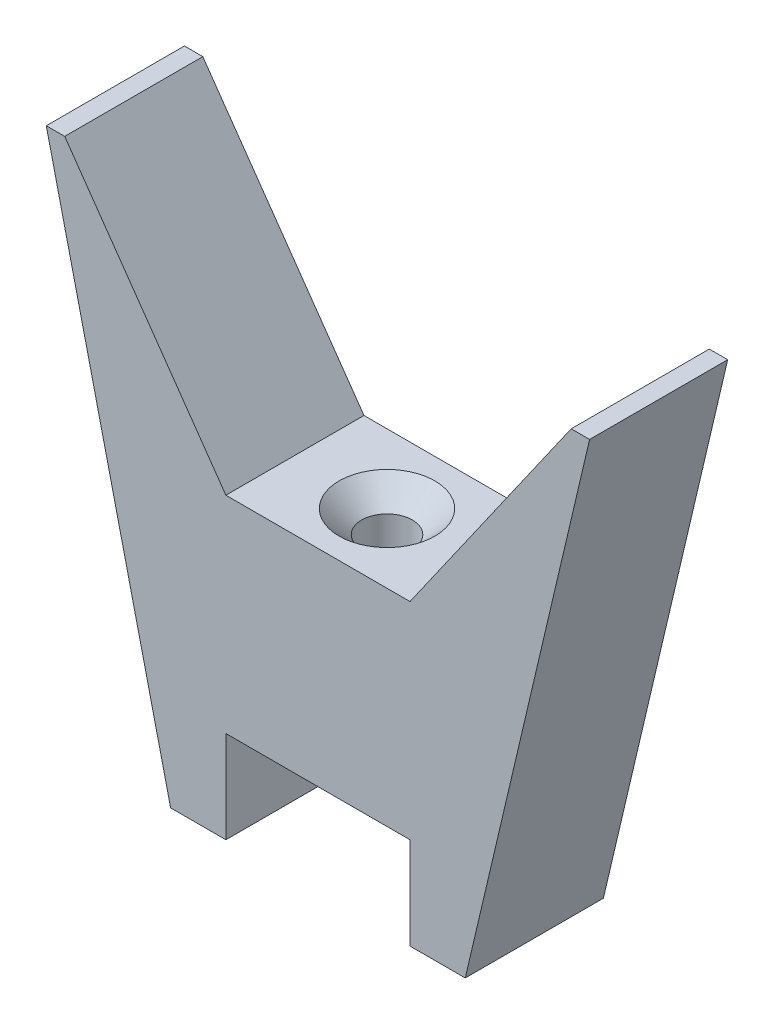
ISO-10303-21;
HEADER;
FILE_DESCRIPTION(('STEP AP214'),'2;1');
FILE_NAME('part.step','',(''),(''),'','','');
FILE_SCHEMA(('AUTOMOTIVE_DESIGN { 1 0 10303 214 1 1 1 1 }'));
ENDSEC;
DATA;
#1=APPLICATION_CONTEXT('core data for automotive mechanical design processes');
#2=APPLICATION_PROTOCOL_DEFINITION('international standard','automotive_design',2000,#1);
#3=PRODUCT_CONTEXT('',#1,'mechanical');
#4=PRODUCT('Part','Part','',(#3));
#5=PRODUCT_RELATED_PRODUCT_CATEGORY('part','',(#4));
#6=PRODUCT_DEFINITION_FORMATION('','',#4);
#7=PRODUCT_DEFINITION_CONTEXT('part definition',#1,'design');
#8=PRODUCT_DEFINITION('design','',#6,#7);
#9=PRODUCT_DEFINITION_SHAPE('','',#8);
#10=(LENGTH_UNIT() NAMED_UNIT(*) SI_UNIT(.MILLI.,.METRE.));
#11=(NAMED_UNIT(*) PLANE_ANGLE_UNIT() SI_UNIT($,.RADIAN.));
#12=(NAMED_UNIT(*) SI_UNIT($,.STERADIAN.) SOLID_ANGLE_UNIT());
#13=UNCERTAINTY_MEASURE_WITH_UNIT(LENGTH_MEASURE(1.E-05),#10,'distance_accuracy_value','');
#14=(GEOMETRIC_REPRESENTATION_CONTEXT(3) GLOBAL_UNCERTAINTY_ASSIGNED_CONTEXT((#13)) GLOBAL_UNIT_ASSIGNED_CONTEXT((#10,
#11,#12)) REPRESENTATION_CONTEXT('',''));
#15=CARTESIAN_POINT('',(0.,0.,0.));
#16=DIRECTION('',(0.,0.,1.));
#17=DIRECTION('',(1.,0.,0.));
#18=AXIS2_PLACEMENT_3D('',#15,#16,#17);
#19=CARTESIAN_POINT('',(-10.,0.,7.5));
#20=DIRECTION('',(0.,1.,0.));
#21=DIRECTION('',(-1.,0.,0.));
#22=AXIS2_PLACEMENT_3D('',#19,#20,#21);
#23=PLANE('',#22);
#24=DIRECTION('',(1.,0.,0.));
#25=VECTOR('',#24,1.);
#26=CARTESIAN_POINT('',(-10.,0.,-7.5));
#27=LINE('',#26,#25);
#28=CARTESIAN_POINT('',(-16.,0.,-7.5));
#29=VERTEX_POINT('',#28);
#30=CARTESIAN_POINT('',(-10.,0.,-7.5));
#31=VERTEX_POINT('',#30);
#32=EDGE_CURVE('E157',#29,#31,#27,.T.);
#33=ORIENTED_EDGE('',*,*,#32,.T.);
#34=DIRECTION('',(0.,0.,-1.));
#35=VECTOR('',#34,1.);
#36=CARTESIAN_POINT('',(-10.,0.,7.5));
#37=LINE('',#36,#35);
#38=CARTESIAN_POINT('',(-10.,0.,7.5));
#39=VERTEX_POINT('',#38);
#40=EDGE_CURVE('E11',#39,#31,#37,.T.);
#41=ORIENTED_EDGE('',*,*,#40,.F.);
#42=DIRECTION('',(1.,0.,0.));
#43=VECTOR('',#42,1.);
#44=CARTESIAN_POINT('',(-10.,0.,7.5));
#45=LINE('',#44,#43);
#46=CARTESIAN_POINT('',(-16.,0.,7.5));
#47=VERTEX_POINT('',#46);
#48=EDGE_CURVE('E179',#47,#39,#45,.T.);
#49=ORIENTED_EDGE('',*,*,#48,.F.);
#50=DIRECTION('',(0.,0.,-1.));
#51=VECTOR('',#50,1.);
#52=CARTESIAN_POINT('',(-16.,0.,7.5));
#53=LINE('',#52,#51);
#54=EDGE_CURVE('E153',#47,#29,#53,.T.);
#55=ORIENTED_EDGE('',*,*,#54,.T.);
#56=EDGE_LOOP('',(#33,#41,#49,#55));
#57=FACE_BOUND('',#56,.T.);
#58=ADVANCED_FACE('F36',(#57),#23,.F.);
#59=CARTESIAN_POINT('',(-10.,0.,7.5));
#60=DIRECTION('',(-1.,0.,0.));
#61=DIRECTION('',(0.,0.,1.));
#62=AXIS2_PLACEMENT_3D('',#59,#60,#61);
#63=PLANE('',#62);
#64=DIRECTION('',(0.,1.,0.));
#65=VECTOR('',#64,1.);
#66=CARTESIAN_POINT('',(-10.,0.,-7.5));
#67=LINE('',#66,#65);
#68=CARTESIAN_POINT('',(-10.,10.,-7.5));
#69=VERTEX_POINT('',#68);
#70=EDGE_CURVE('E160',#31,#69,#67,.T.);
#71=ORIENTED_EDGE('',*,*,#70,.T.);
#72=DIRECTION('',(0.,0.,-1.));
#73=VECTOR('',#72,1.);
#74=CARTESIAN_POINT('',(-10.,10.,7.5));
#75=LINE('',#74,#73);
#76=CARTESIAN_POINT('',(-10.,10.,7.5));
#77=VERTEX_POINT('',#76);
#78=EDGE_CURVE('E45',#77,#69,#75,.T.);
#79=ORIENTED_EDGE('',*,*,#78,.F.);
#80=DIRECTION('',(0.,1.,0.));
#81=VECTOR('',#80,1.);
#82=CARTESIAN_POINT('',(-10.,0.,7.5));
#83=LINE('',#82,#81);
#84=EDGE_CURVE('E108',#39,#77,#83,.T.);
#85=ORIENTED_EDGE('',*,*,#84,.F.);
#86=ORIENTED_EDGE('',*,*,#40,.T.);
#87=EDGE_LOOP('',(#71,#79,#85,#86));
#88=FACE_BOUND('',#87,.T.);
#89=ADVANCED_FACE('F258',(#88),#63,.F.);
#90=CARTESIAN_POINT('',(-10.,10.,7.5));
#91=DIRECTION('',(0.,1.,0.));
#92=DIRECTION('',(0.,0.,1.));
#93=AXIS2_PLACEMENT_3D('',#90,#91,#92);
#94=PLANE('',#93);
#95=CARTESIAN_POINT('',(0.,10.,0.));
#96=DIRECTION('',(0.,1.,0.));
#97=DIRECTION('',(0.,0.,1.));
#98=AXIS2_PLACEMENT_3D('',#95,#96,#97);
#99=CIRCLE('',#98,2.74999999999999);
#100=CARTESIAN_POINT('',(0.,10.,2.74999999999999));
#101=VERTEX_POINT('',#100);
#102=EDGE_CURVE('E39',#101,#101,#99,.T.);
#103=ORIENTED_EDGE('',*,*,#102,.T.);
#104=EDGE_LOOP('',(#103));
#105=FACE_BOUND('',#104,.T.);
#106=DIRECTION('',(1.,0.,0.));
#107=VECTOR('',#106,1.);
#108=CARTESIAN_POINT('',(-10.,10.,-7.5));
#109=LINE('',#108,#107);
#110=CARTESIAN_POINT('',(10.,10.,-7.5));
#111=VERTEX_POINT('',#110);
#112=EDGE_CURVE('E162',#69,#111,#109,.T.);
#113=ORIENTED_EDGE('',*,*,#112,.T.);
#114=DIRECTION('',(0.,0.,-1.));
#115=VECTOR('',#114,1.);
#116=CARTESIAN_POINT('',(10.,10.,7.5));
#117=LINE('',#116,#115);
#118=CARTESIAN_POINT('',(10.,10.,7.5));
#119=VERTEX_POINT('',#118);
#120=EDGE_CURVE('E198',#119,#111,#117,.T.);
#121=ORIENTED_EDGE('',*,*,#120,.F.);
#122=DIRECTION('',(1.,0.,0.));
#123=VECTOR('',#122,1.);
#124=CARTESIAN_POINT('',(-10.,10.,7.5));
#125=LINE('',#124,#123);
#126=EDGE_CURVE('E207',#77,#119,#125,.T.);
#127=ORIENTED_EDGE('',*,*,#126,.F.);
#128=ORIENTED_EDGE('',*,*,#78,.T.);
#129=EDGE_LOOP('',(#113,#121,#127,#128));
#130=FACE_BOUND('',#129,.T.);
#131=ADVANCED_FACE('F205',(#105,#130),#94,.F.);
#132=CARTESIAN_POINT('',(10.,0.,7.5));
#133=DIRECTION('',(1.,0.,0.));
#134=DIRECTION('',(0.,0.,-1.));
#135=AXIS2_PLACEMENT_3D('',#132,#133,#134);
#136=PLANE('',#135);
#137=DIRECTION('',(0.,-1.,0.));
#138=VECTOR('',#137,1.);
#139=CARTESIAN_POINT('',(10.,0.,-7.5));
#140=LINE('',#139,#138);
#141=CARTESIAN_POINT('',(10.,0.,-7.5));
#142=VERTEX_POINT('',#141);
#143=EDGE_CURVE('E164',#111,#142,#140,.T.);
#144=ORIENTED_EDGE('',*,*,#143,.T.);
#145=DIRECTION('',(0.,0.,-1.));
#146=VECTOR('',#145,1.);
#147=CARTESIAN_POINT('',(10.,0.,7.5));
#148=LINE('',#147,#146);
#149=CARTESIAN_POINT('',(10.,0.,7.5));
#150=VERTEX_POINT('',#149);
#151=EDGE_CURVE('E195',#150,#142,#148,.T.);
#152=ORIENTED_EDGE('',*,*,#151,.F.);
#153=DIRECTION('',(0.,-1.,0.));
#154=VECTOR('',#153,1.);
#155=CARTESIAN_POINT('',(10.,0.,7.5));
#156=LINE('',#155,#154);
#157=EDGE_CURVE('E225',#119,#150,#156,.T.);
#158=ORIENTED_EDGE('',*,*,#157,.F.);
#159=ORIENTED_EDGE('',*,*,#120,.T.);
#160=EDGE_LOOP('',(#144,#152,#158,#159));
#161=FACE_BOUND('',#160,.T.);
#162=ADVANCED_FACE('F216',(#161),#136,.F.);
#163=CARTESIAN_POINT('',(10.,0.,7.5));
#164=DIRECTION('',(0.,1.,0.));
#165=DIRECTION('',(-1.,0.,0.));
#166=AXIS2_PLACEMENT_3D('',#163,#164,#165);
#167=PLANE('',#166);
#168=DIRECTION('',(1.,0.,0.));
#169=VECTOR('',#168,1.);
#170=CARTESIAN_POINT('',(10.,0.,-7.5));
#171=LINE('',#170,#169);
#172=CARTESIAN_POINT('',(16.,0.,-7.5));
#173=VERTEX_POINT('',#172);
#174=EDGE_CURVE('E166',#142,#173,#171,.T.);
#175=ORIENTED_EDGE('',*,*,#174,.T.);
#176=DIRECTION('',(0.,0.,-1.));
#177=VECTOR('',#176,1.);
#178=CARTESIAN_POINT('',(16.,0.,7.5));
#179=LINE('',#178,#177);
#180=CARTESIAN_POINT('',(16.,0.,7.5));
#181=VERTEX_POINT('',#180);
#182=EDGE_CURVE('E192',#181,#173,#179,.T.);
#183=ORIENTED_EDGE('',*,*,#182,.F.);
#184=DIRECTION('',(1.,0.,0.));
#185=VECTOR('',#184,1.);
#186=CARTESIAN_POINT('',(10.,0.,7.5));
#187=LINE('',#186,#185);
#188=EDGE_CURVE('E222',#150,#181,#187,.T.);
#189=ORIENTED_EDGE('',*,*,#188,.F.);
#190=ORIENTED_EDGE('',*,*,#151,.T.);
#191=EDGE_LOOP('',(#175,#183,#189,#190));
#192=FACE_BOUND('',#191,.T.);
#193=ADVANCED_FACE('F220',(#192),#167,.F.);
#194=CARTESIAN_POINT('',(16.,0.,7.5));
#195=DIRECTION('',(-0.973429070908722,0.22898874188436,0.));
#196=DIRECTION('',(-0.22898874188436,-0.973429070908722,0.));
#197=AXIS2_PLACEMENT_3D('',#194,#195,#196);
#198=PLANE('',#197);
#199=DIRECTION('',(0.22898874188436,0.973429070908722,0.));
#200=VECTOR('',#199,1.);
#201=CARTESIAN_POINT('',(16.,0.,-7.5));
#202=LINE('',#201,#200);
#203=CARTESIAN_POINT('',(29.5051884552424,57.4104339901248,-7.5));
#204=VERTEX_POINT('',#203);
#205=EDGE_CURVE('E168',#173,#204,#202,.T.);
#206=ORIENTED_EDGE('',*,*,#205,.T.);
#207=DIRECTION('',(0.,0.,-1.));
#208=VECTOR('',#207,1.);
#209=CARTESIAN_POINT('',(29.5051884552424,57.4104339901248,7.5));
#210=LINE('',#209,#208);
#211=CARTESIAN_POINT('',(29.5051884552424,57.4104339901248,7.5));
#212=VERTEX_POINT('',#211);
#213=EDGE_CURVE('E189',#212,#204,#210,.T.);
#214=ORIENTED_EDGE('',*,*,#213,.F.);
#215=DIRECTION('',(0.22898874188436,0.973429070908722,0.));
#216=VECTOR('',#215,1.);
#217=CARTESIAN_POINT('',(16.,0.,7.5));
#218=LINE('',#217,#216);
#219=EDGE_CURVE('E224',#181,#212,#218,.T.);
#220=ORIENTED_EDGE('',*,*,#219,.F.);
#221=ORIENTED_EDGE('',*,*,#182,.T.);
#222=EDGE_LOOP('',(#206,#214,#220,#221));
#223=FACE_BOUND('',#222,.T.);
#224=ADVANCED_FACE('F272',(#223),#198,.F.);
#225=CARTESIAN_POINT('',(29.5051884552424,57.4104339901248,7.5));
#226=DIRECTION('',(0.,-1.,0.));
#227=DIRECTION('',(0.,0.,-1.));
#228=AXIS2_PLACEMENT_3D('',#225,#226,#227);
#229=PLANE('',#228);
#230=DIRECTION('',(-1.,0.,0.));
#231=VECTOR('',#230,1.);
#232=CARTESIAN_POINT('',(29.5051884552424,57.4104339901248,-7.5));
#233=LINE('',#232,#231);
#234=CARTESIAN_POINT('',(27.5051884552424,57.4104339901248,-7.5));
#235=VERTEX_POINT('',#234);
#236=EDGE_CURVE('E170',#204,#235,#233,.T.);
#237=ORIENTED_EDGE('',*,*,#236,.T.);
#238=DIRECTION('',(0.,0.,-1.));
#239=VECTOR('',#238,1.);
#240=CARTESIAN_POINT('',(27.5051884552424,57.4104339901248,7.5));
#241=LINE('',#240,#239);
#242=CARTESIAN_POINT('',(27.5051884552424,57.4104339901248,7.5));
#243=VERTEX_POINT('',#242);
#244=EDGE_CURVE('E186',#243,#235,#241,.T.);
#245=ORIENTED_EDGE('',*,*,#244,.F.);
#246=DIRECTION('',(-1.,0.,0.));
#247=VECTOR('',#246,1.);
#248=CARTESIAN_POINT('',(29.5051884552424,57.4104339901248,7.5));
#249=LINE('',#248,#247);
#250=EDGE_CURVE('E227',#212,#243,#249,.T.);
#251=ORIENTED_EDGE('',*,*,#250,.F.);
#252=ORIENTED_EDGE('',*,*,#213,.T.);
#253=EDGE_LOOP('',(#237,#245,#251,#252));
#254=FACE_BOUND('',#253,.T.);
#255=ADVANCED_FACE('F275',(#254),#229,.F.);
#256=CARTESIAN_POINT('',(27.5051884552424,57.4104339901248,7.5));
#257=DIRECTION('',(0.819152044288998,-0.573576436351037,0.));
#258=DIRECTION('',(0.573576436351037,0.819152044288998,0.));
#259=AXIS2_PLACEMENT_3D('',#256,#257,#258);
#260=PLANE('',#259);
#261=DIRECTION('',(-0.573576436351037,-0.819152044288998,0.));
#262=VECTOR('',#261,1.);
#263=CARTESIAN_POINT('',(27.5051884552424,57.4104339901248,-7.5));
#264=LINE('',#263,#262);
#265=CARTESIAN_POINT('',(10.,32.4104339901248,-7.5));
#266=VERTEX_POINT('',#265);
#267=EDGE_CURVE('E172',#235,#266,#264,.T.);
#268=ORIENTED_EDGE('',*,*,#267,.T.);
#269=DIRECTION('',(0.,0.,-1.));
#270=VECTOR('',#269,1.);
#271=CARTESIAN_POINT('',(10.,32.4104339901248,7.5));
#272=LINE('',#271,#270);
#273=CARTESIAN_POINT('',(10.,32.4104339901248,7.5));
#274=VERTEX_POINT('',#273);
#275=EDGE_CURVE('E183',#274,#266,#272,.T.);
#276=ORIENTED_EDGE('',*,*,#275,.F.);
#277=DIRECTION('',(-0.573576436351037,-0.819152044288998,0.));
#278=VECTOR('',#277,1.);
#279=CARTESIAN_POINT('',(27.5051884552424,57.4104339901248,7.5));
#280=LINE('',#279,#278);
#281=EDGE_CURVE('E233',#243,#274,#280,.T.);
#282=ORIENTED_EDGE('',*,*,#281,.F.);
#283=ORIENTED_EDGE('',*,*,#244,.T.);
#284=EDGE_LOOP('',(#268,#276,#282,#283));
#285=FACE_BOUND('',#284,.T.);
#286=ADVANCED_FACE('F239',(#285),#260,.F.);
#287=CARTESIAN_POINT('',(-10.,32.4104339901248,7.5));
#288=DIRECTION('',(0.,-1.,0.));
#289=DIRECTION('',(0.,0.,-1.));
#290=AXIS2_PLACEMENT_3D('',#287,#288,#289);
#291=PLANE('',#290);
#292=CARTESIAN_POINT('',(0.,32.4104339901248,0.));
#293=DIRECTION('',(0.,1.,0.));
#294=DIRECTION('',(0.,0.,1.));
#295=AXIS2_PLACEMENT_3D('',#292,#293,#294);
#296=CIRCLE('',#295,5.2);
#297=CARTESIAN_POINT('',(0.,32.4104339901248,5.2));
#298=VERTEX_POINT('',#297);
#299=EDGE_CURVE('E423',#298,#298,#296,.T.);
#300=ORIENTED_EDGE('',*,*,#299,.F.);
#301=EDGE_LOOP('',(#300));
#302=FACE_BOUND('',#301,.T.);
#303=DIRECTION('',(-1.,0.,0.));
#304=VECTOR('',#303,1.);
#305=CARTESIAN_POINT('',(-10.,32.4104339901248,-7.5));
#306=LINE('',#305,#304);
#307=CARTESIAN_POINT('',(-10.,32.4104339901248,-7.5));
#308=VERTEX_POINT('',#307);
#309=EDGE_CURVE('E174',#266,#308,#306,.T.);
#310=ORIENTED_EDGE('',*,*,#309,.T.);
#311=DIRECTION('',(0.,0.,-1.));
#312=VECTOR('',#311,1.);
#313=CARTESIAN_POINT('',(-10.,32.4104339901248,7.5));
#314=LINE('',#313,#312);
#315=CARTESIAN_POINT('',(-10.,32.4104339901248,7.5));
#316=VERTEX_POINT('',#315);
#317=EDGE_CURVE('E148',#316,#308,#314,.T.);
#318=ORIENTED_EDGE('',*,*,#317,.F.);
#319=DIRECTION('',(-1.,0.,0.));
#320=VECTOR('',#319,1.);
#321=CARTESIAN_POINT('',(-10.,32.4104339901248,7.5));
#322=LINE('',#321,#320);
#323=EDGE_CURVE('E139',#274,#316,#322,.T.);
#324=ORIENTED_EDGE('',*,*,#323,.F.);
#325=ORIENTED_EDGE('',*,*,#275,.T.);
#326=EDGE_LOOP('',(#310,#318,#324,#325));
#327=FACE_BOUND('',#326,.T.);
#328=ADVANCED_FACE('F243',(#302,#327),#291,.F.);
#329=CARTESIAN_POINT('',(-27.5051884552433,57.4104339901266,7.5));
#330=DIRECTION('',(-0.819152044289002,-0.573576436351031,0.));
#331=DIRECTION('',(0.573576436351031,-0.819152044289003,0.));
#332=AXIS2_PLACEMENT_3D('',#329,#330,#331);
#333=PLANE('',#332);
#334=DIRECTION('',(-0.573576436351031,0.819152044289003,0.));
#335=VECTOR('',#334,1.);
#336=CARTESIAN_POINT('',(-27.5051884552433,57.4104339901266,-7.5));
#337=LINE('',#336,#335);
#338=CARTESIAN_POINT('',(-27.5051884552433,57.4104339901266,-7.5));
#339=VERTEX_POINT('',#338);
#340=EDGE_CURVE('E147',#308,#339,#337,.T.);
#341=ORIENTED_EDGE('',*,*,#340,.T.);
#342=DIRECTION('',(0.,0.,-1.));
#343=VECTOR('',#342,1.);
#344=CARTESIAN_POINT('',(-27.5051884552433,57.4104339901266,7.5));
#345=LINE('',#344,#343);
#346=CARTESIAN_POINT('',(-27.5051884552433,57.4104339901266,7.5));
#347=VERTEX_POINT('',#346);
#348=EDGE_CURVE('E144',#347,#339,#345,.T.);
#349=ORIENTED_EDGE('',*,*,#348,.F.);
#350=DIRECTION('',(-0.573576436351031,0.819152044289003,0.));
#351=VECTOR('',#350,1.);
#352=CARTESIAN_POINT('',(-27.5051884552433,57.4104339901266,7.5));
#353=LINE('',#352,#351);
#354=EDGE_CURVE('E133',#316,#347,#353,.T.);
#355=ORIENTED_EDGE('',*,*,#354,.F.);
#356=ORIENTED_EDGE('',*,*,#317,.T.);
#357=EDGE_LOOP('',(#341,#349,#355,#356));
#358=FACE_BOUND('',#357,.T.);
#359=ADVANCED_FACE('F145',(#358),#333,.F.);
#360=CARTESIAN_POINT('',(-29.5051884552433,57.4104339901266,7.5));
#361=DIRECTION('',(0.,-1.,0.));
#362=DIRECTION('',(0.,0.,-1.));
#363=AXIS2_PLACEMENT_3D('',#360,#361,#362);
#364=PLANE('',#363);
#365=DIRECTION('',(-1.,0.,0.));
#366=VECTOR('',#365,1.);
#367=CARTESIAN_POINT('',(-29.5051884552433,57.4104339901266,-7.5));
#368=LINE('',#367,#366);
#369=CARTESIAN_POINT('',(-29.5051884552433,57.4104339901266,-7.5));
#370=VERTEX_POINT('',#369);
#371=EDGE_CURVE('E94',#339,#370,#368,.T.);
#372=ORIENTED_EDGE('',*,*,#371,.T.);
#373=DIRECTION('',(0.,0.,-1.));
#374=VECTOR('',#373,1.);
#375=CARTESIAN_POINT('',(-29.5051884552433,57.4104339901266,7.5));
#376=LINE('',#375,#374);
#377=CARTESIAN_POINT('',(-29.5051884552433,57.4104339901266,7.5));
#378=VERTEX_POINT('',#377);
#379=EDGE_CURVE('E149',#378,#370,#376,.T.);
#380=ORIENTED_EDGE('',*,*,#379,.F.);
#381=DIRECTION('',(-1.,0.,0.));
#382=VECTOR('',#381,1.);
#383=CARTESIAN_POINT('',(-29.5051884552433,57.4104339901266,7.5));
#384=LINE('',#383,#382);
#385=EDGE_CURVE('E137',#347,#378,#384,.T.);
#386=ORIENTED_EDGE('',*,*,#385,.F.);
#387=ORIENTED_EDGE('',*,*,#348,.T.);
#388=EDGE_LOOP('',(#372,#380,#386,#387));
#389=FACE_BOUND('',#388,.T.);
#390=ADVANCED_FACE('F151',(#389),#364,.F.);
#391=CARTESIAN_POINT('',(-29.5051884552433,57.4104339901266,7.5));
#392=DIRECTION('',(0.97342907090872,0.228988741884368,0.));
#393=DIRECTION('',(-0.228988741884368,0.97342907090872,0.));
#394=AXIS2_PLACEMENT_3D('',#391,#392,#393);
#395=PLANE('',#394);
#396=DIRECTION('',(0.228988741884368,-0.97342907090872,0.));
#397=VECTOR('',#396,1.);
#398=CARTESIAN_POINT('',(-29.5051884552433,57.4104339901266,-7.5));
#399=LINE('',#398,#397);
#400=EDGE_CURVE('E100',#370,#29,#399,.T.);
#401=ORIENTED_EDGE('',*,*,#400,.T.);
#402=ORIENTED_EDGE('',*,*,#54,.F.);
#403=DIRECTION('',(0.228988741884368,-0.97342907090872,0.));
#404=VECTOR('',#403,1.);
#405=CARTESIAN_POINT('',(-29.5051884552433,57.4104339901266,7.5));
#406=LINE('',#405,#404);
#407=EDGE_CURVE('E53',#378,#47,#406,.T.);
#408=ORIENTED_EDGE('',*,*,#407,.F.);
#409=ORIENTED_EDGE('',*,*,#379,.T.);
#410=EDGE_LOOP('',(#401,#402,#408,#409));
#411=FACE_BOUND('',#410,.T.);
#412=ADVANCED_FACE('F247',(#411),#395,.F.);
#413=CARTESIAN_POINT('',(0.,0.,7.5));
#414=DIRECTION('',(0.,0.,-1.));
#415=DIRECTION('',(-1.,0.,0.));
#416=AXIS2_PLACEMENT_3D('',#413,#414,#415);
#417=PLANE('',#416);
#418=ORIENTED_EDGE('',*,*,#48,.T.);
#419=ORIENTED_EDGE('',*,*,#84,.T.);
#420=ORIENTED_EDGE('',*,*,#126,.T.);
#421=ORIENTED_EDGE('',*,*,#157,.T.);
#422=ORIENTED_EDGE('',*,*,#188,.T.);
#423=ORIENTED_EDGE('',*,*,#219,.T.);
#424=ORIENTED_EDGE('',*,*,#250,.T.);
#425=ORIENTED_EDGE('',*,*,#281,.T.);
#426=ORIENTED_EDGE('',*,*,#323,.T.);
#427=ORIENTED_EDGE('',*,*,#354,.T.);
#428=ORIENTED_EDGE('',*,*,#385,.T.);
#429=ORIENTED_EDGE('',*,*,#407,.T.);
#430=EDGE_LOOP('',(#418,#419,#420,#421,#422,#423,#424,#425,#426,#427,#428,#429));
#431=FACE_BOUND('',#430,.T.);
#432=ADVANCED_FACE('F135',(#431),#417,.F.);
#433=CARTESIAN_POINT('',(0.,0.,-7.5));
#434=DIRECTION('',(0.,0.,-1.));
#435=DIRECTION('',(-1.,0.,0.));
#436=AXIS2_PLACEMENT_3D('',#433,#434,#435);
#437=PLANE('',#436);
#438=ORIENTED_EDGE('',*,*,#32,.F.);
#439=ORIENTED_EDGE('',*,*,#400,.F.);
#440=ORIENTED_EDGE('',*,*,#371,.F.);
#441=ORIENTED_EDGE('',*,*,#340,.F.);
#442=ORIENTED_EDGE('',*,*,#309,.F.);
#443=ORIENTED_EDGE('',*,*,#267,.F.);
#444=ORIENTED_EDGE('',*,*,#236,.F.);
#445=ORIENTED_EDGE('',*,*,#205,.F.);
#446=ORIENTED_EDGE('',*,*,#174,.F.);
#447=ORIENTED_EDGE('',*,*,#143,.F.);
#448=ORIENTED_EDGE('',*,*,#112,.F.);
#449=ORIENTED_EDGE('',*,*,#70,.F.);
#450=EDGE_LOOP('',(#438,#439,#440,#441,#442,#443,#444,#445,#446,#447,#448,#449));
#451=FACE_BOUND('',#450,.T.);
#452=ADVANCED_FACE('F211',(#451),#437,.T.);
#453=CARTESIAN_POINT('',(0.,32.4104339901248,0.));
#454=DIRECTION('',(0.,1.,0.));
#455=DIRECTION('',(0.,0.,1.));
#456=AXIS2_PLACEMENT_3D('',#453,#454,#455);
#457=CYLINDRICAL_SURFACE('',#456,2.74999999999999);
#458=CARTESIAN_POINT('',(0.,29.9604339901248,0.));
#459=DIRECTION('',(0.,1.,0.));
#460=DIRECTION('',(0.,0.,1.));
#461=AXIS2_PLACEMENT_3D('',#458,#459,#460);
#462=CIRCLE('',#461,2.75);
#463=CARTESIAN_POINT('',(0.,29.9604339901248,2.75));
#464=VERTEX_POINT('',#463);
#465=EDGE_CURVE('E420',#464,#464,#462,.T.);
#466=ORIENTED_EDGE('',*,*,#465,.T.);
#467=EDGE_LOOP('',(#466));
#468=FACE_BOUND('',#467,.T.);
#469=ORIENTED_EDGE('',*,*,#102,.F.);
#470=EDGE_LOOP('',(#469));
#471=FACE_BOUND('',#470,.T.);
#472=ADVANCED_FACE('F317',(#468,#471),#457,.F.);
#473=CARTESIAN_POINT('',(0.,32.4104339901248,0.));
#474=DIRECTION('',(0.,1.,0.));
#475=DIRECTION('',(0.,0.,1.));
#476=AXIS2_PLACEMENT_3D('',#473,#474,#475);
#477=CONICAL_SURFACE('',#476,5.2,0.785398163397449);
#478=ORIENTED_EDGE('',*,*,#465,.F.);
#479=EDGE_LOOP('',(#478));
#480=FACE_BOUND('',#479,.T.);
#481=ORIENTED_EDGE('',*,*,#299,.T.);
#482=EDGE_LOOP('',(#481));
#483=FACE_BOUND('',#482,.T.);
#484=ADVANCED_FACE('F341',(#480,#483),#477,.F.);
#485=CLOSED_SHELL('',(#58,#89,#131,#162,#193,#224,#255,#286,#328,#359,#390,#412,#432,#452,#472,#484));
#486=MANIFOLD_SOLID_BREP('B2',#485);
#487=ADVANCED_BREP_SHAPE_REPRESENTATION('',(#18,#486),#14);
#488=SHAPE_DEFINITION_REPRESENTATION(#9,#487);
ENDSEC;
END-ISO-10303-21;
